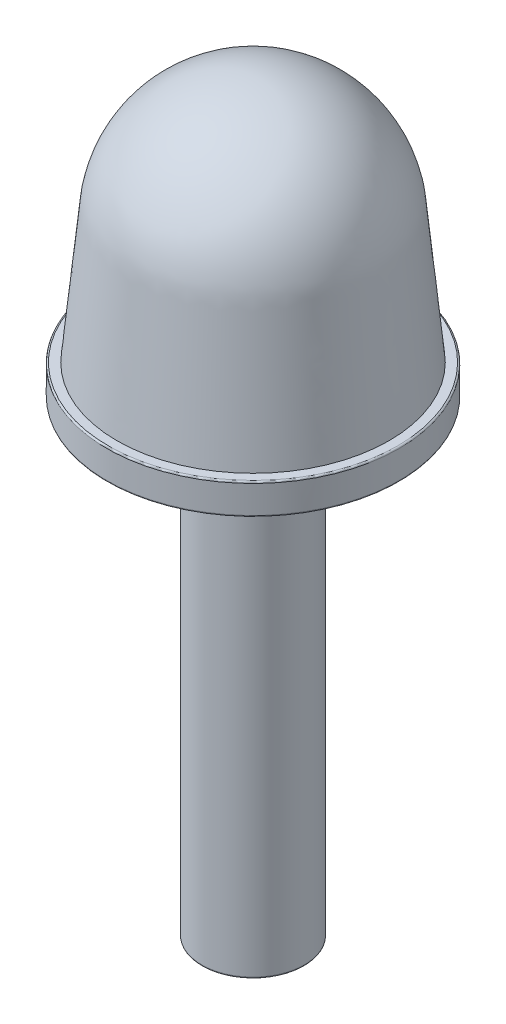
ISO-10303-21;
HEADER;
FILE_DESCRIPTION(('STEP AP214'),'2;1');
FILE_NAME('part.step','',(''),(''),'','','');
FILE_SCHEMA(('AUTOMOTIVE_DESIGN { 1 0 10303 214 1 1 1 1 }'));
ENDSEC;
DATA;
#1=APPLICATION_CONTEXT('core data for automotive mechanical design processes');
#2=APPLICATION_PROTOCOL_DEFINITION('international standard','automotive_design',2000,#1);
#3=PRODUCT_CONTEXT('',#1,'mechanical');
#4=PRODUCT('Part','Part','',(#3));
#5=PRODUCT_RELATED_PRODUCT_CATEGORY('part','',(#4));
#6=PRODUCT_DEFINITION_FORMATION('','',#4);
#7=PRODUCT_DEFINITION_CONTEXT('part definition',#1,'design');
#8=PRODUCT_DEFINITION('design','',#6,#7);
#9=PRODUCT_DEFINITION_SHAPE('','',#8);
#10=(LENGTH_UNIT() NAMED_UNIT(*) SI_UNIT(.MILLI.,.METRE.));
#11=(NAMED_UNIT(*) PLANE_ANGLE_UNIT() SI_UNIT($,.RADIAN.));
#12=(NAMED_UNIT(*) SI_UNIT($,.STERADIAN.) SOLID_ANGLE_UNIT());
#13=UNCERTAINTY_MEASURE_WITH_UNIT(LENGTH_MEASURE(1.E-05),#10,'distance_accuracy_value','');
#14=(GEOMETRIC_REPRESENTATION_CONTEXT(3) GLOBAL_UNCERTAINTY_ASSIGNED_CONTEXT((#13)) GLOBAL_UNIT_ASSIGNED_CONTEXT((#10,
#11,#12)) REPRESENTATION_CONTEXT('',''));
#15=CARTESIAN_POINT('',(0.,0.,0.));
#16=DIRECTION('',(0.,0.,1.));
#17=DIRECTION('',(1.,0.,0.));
#18=AXIS2_PLACEMENT_3D('',#15,#16,#17);
#19=CARTESIAN_POINT('',(13.25,-24.,0.));
#20=CARTESIAN_POINT('',(12.8762888931904,-20.234768096144,0.));
#21=CARTESIAN_POINT('',(12.5025777863808,-16.4695361922879,0.));
#22=CARTESIAN_POINT('',(12.1288666795712,-12.7043042884319,0.));
#23=CARTESIAN_POINT('',(12.1080288298059,-12.4943577941634,0.));
#24=CARTESIAN_POINT('',(12.0663531302754,-12.0744648056265,0.));
#25=CARTESIAN_POINT('',(12.0038395809797,-11.4446253228211,0.));
#26=CARTESIAN_POINT('',(11.9621638814492,-11.0247323342841,0.));
#27=CARTESIAN_POINT('',(11.9413260316839,-10.8147858400157,0.));
#28=CARTESIAN_POINT('',(11.9136003956724,-10.535443194418,0.));
#29=CARTESIAN_POINT('',(11.8581491236493,-9.97675790322282,0.));
#30=CARTESIAN_POINT('',(11.6665551392833,-9.1489857320982,0.));
#31=CARTESIAN_POINT('',(11.5141248420591,-8.60828507300223,0.));
#32=CARTESIAN_POINT('',(11.4285286542079,-8.34093826234789,0.));
#33=CARTESIAN_POINT('',(9.77905012195438,-3.18904031091958,0.));
#34=CARTESIAN_POINT('',(5.40951309549189,0.,0.));
#35=CARTESIAN_POINT('',(1.74198293753745E-13,0.,0.));
#36=(BOUNDED_CURVE() B_SPLINE_CURVE(3,(#19,#20,#21,#22,#23,#24,#25,#26,#27,#28,#29,#30,#31,#32,
#33,#34,#35),.UNSPECIFIED.,.F.,.F.) B_SPLINE_CURVE_WITH_KNOTS((4,3,1,1,3,1,1,3,4),(0.,
0.379321245469799,0.400471912340112,0.421622579210425,0.442773246080738,0.47091509841456,
0.499056950748383,0.527198803082205,1.),
.UNSPECIFIED.) CURVE() GEOMETRIC_REPRESENTATION_ITEM() RATIONAL_B_SPLINE_CURVE((1.,1.,1.,1.,1.,
1.,1.,1.,1.,1.,1.,1.,1.,1.,0.871833681310322,0.871833681310322,1.)) REPRESENTATION_ITEM(''));
#37=CARTESIAN_POINT('',(1.74198293753745E-13,0.,0.));
#38=DIRECTION('',(0.,1.,0.));
#39=AXIS1_PLACEMENT('',#37,#38);
#40=SURFACE_OF_REVOLUTION('',#36,#39);
#41=CARTESIAN_POINT('',(1.74198293753745E-13,0.,0.));
#42=VERTEX_POINT('',#41);
#43=VERTEX_LOOP('',#42);
#44=FACE_BOUND('',#43,.T.);
#45=CARTESIAN_POINT('',(1.19471804001493E-13,-24.,0.));
#46=DIRECTION('',(0.,1.,0.));
#47=DIRECTION('',(-1.,0.,0.));
#48=AXIS2_PLACEMENT_3D('',#45,#46,#47);
#49=CIRCLE('',#48,13.2499999999999);
#50=CARTESIAN_POINT('',(-13.2499999999998,-23.9999999999999,0.));
#51=VERTEX_POINT('',#50);
#52=EDGE_CURVE('E49',#51,#51,#49,.T.);
#53=ORIENTED_EDGE('',*,*,#52,.T.);
#54=EDGE_LOOP('',(#53));
#55=FACE_BOUND('',#54,.T.);
#56=ADVANCED_FACE('F33',(#44,#55),#40,.T.);
#57=CARTESIAN_POINT('',(13.25,-24.,0.));
#58=DIRECTION('',(0.,-1.,0.));
#59=DIRECTION('',(1.,0.,0.));
#60=AXIS2_PLACEMENT_3D('',#57,#58,#59);
#61=PLANE('',#60);
#62=CARTESIAN_POINT('',(1.19471804001493E-13,-24.,0.));
#63=DIRECTION('',(0.,-1.,0.));
#64=DIRECTION('',(1.,0.,0.));
#65=AXIS2_PLACEMENT_3D('',#62,#63,#64);
#66=CIRCLE('',#65,14.0999999999999);
#67=CARTESIAN_POINT('',(14.1,-24.,0.));
#68=VERTEX_POINT('',#67);
#69=EDGE_CURVE('E11',#68,#68,#66,.F.);
#70=ORIENTED_EDGE('',*,*,#69,.T.);
#71=EDGE_LOOP('',(#70));
#72=FACE_BOUND('',#71,.T.);
#73=ORIENTED_EDGE('',*,*,#52,.F.);
#74=EDGE_LOOP('',(#73));
#75=FACE_BOUND('',#74,.T.);
#76=ADVANCED_FACE('F45',(#72,#75),#61,.F.);
#77=CARTESIAN_POINT('',(1.74198293753745E-13,0.,0.));
#78=DIRECTION('',(0.,1.,0.));
#79=DIRECTION('',(-1.,0.,0.));
#80=AXIS2_PLACEMENT_3D('',#77,#78,#79);
#81=CYLINDRICAL_SURFACE('',#80,14.2499999999999);
#82=CARTESIAN_POINT('',(1.12973033343413E-13,-26.85,0.));
#83=DIRECTION('',(0.,1.,0.));
#84=DIRECTION('',(-1.,0.,0.));
#85=AXIS2_PLACEMENT_3D('',#82,#83,#84);
#86=CIRCLE('',#85,14.2499999999999);
#87=CARTESIAN_POINT('',(-14.2499999999998,-26.8499999999999,0.));
#88=VERTEX_POINT('',#87);
#89=EDGE_CURVE('E40',#88,#88,#86,.T.);
#90=ORIENTED_EDGE('',*,*,#89,.T.);
#91=EDGE_LOOP('',(#90));
#92=FACE_BOUND('',#91,.T.);
#93=CARTESIAN_POINT('',(1.19129763440542E-13,-24.15,0.));
#94=DIRECTION('',(0.,-1.,0.));
#95=DIRECTION('',(1.,0.,0.));
#96=AXIS2_PLACEMENT_3D('',#93,#94,#95);
#97=CIRCLE('',#96,14.2499999999999);
#98=CARTESIAN_POINT('',(14.25,-24.15,0.));
#99=VERTEX_POINT('',#98);
#100=EDGE_CURVE('E84',#99,#99,#97,.T.);
#101=ORIENTED_EDGE('',*,*,#100,.T.);
#102=EDGE_LOOP('',(#101));
#103=FACE_BOUND('',#102,.T.);
#104=ADVANCED_FACE('F89',(#92,#103),#81,.T.);
#105=CARTESIAN_POINT('',(14.25,-27.,0.));
#106=DIRECTION('',(0.,1.,0.));
#107=DIRECTION('',(-1.,0.,0.));
#108=AXIS2_PLACEMENT_3D('',#105,#106,#107);
#109=PLANE('',#108);
#110=CARTESIAN_POINT('',(1.12630992782462E-13,-27.,0.));
#111=DIRECTION('',(0.,1.,0.));
#112=DIRECTION('',(-1.,0.,0.));
#113=AXIS2_PLACEMENT_3D('',#110,#111,#112);
#114=CIRCLE('',#113,9.14999999999989);
#115=CARTESIAN_POINT('',(-9.14999999999978,-27.,0.));
#116=VERTEX_POINT('',#115);
#117=EDGE_CURVE('E81',#116,#116,#114,.T.);
#118=ORIENTED_EDGE('',*,*,#117,.T.);
#119=EDGE_LOOP('',(#118));
#120=FACE_BOUND('',#119,.T.);
#121=CARTESIAN_POINT('',(1.12630992782462E-13,-27.,0.));
#122=DIRECTION('',(0.,1.,0.));
#123=DIRECTION('',(-1.,0.,0.));
#124=AXIS2_PLACEMENT_3D('',#121,#122,#123);
#125=CIRCLE('',#124,14.0999999999999);
#126=CARTESIAN_POINT('',(-14.0999999999998,-26.9999999999999,0.));
#127=VERTEX_POINT('',#126);
#128=EDGE_CURVE('E78',#127,#127,#125,.F.);
#129=ORIENTED_EDGE('',*,*,#128,.T.);
#130=EDGE_LOOP('',(#129));
#131=FACE_BOUND('',#130,.T.);
#132=ADVANCED_FACE('F123',(#120,#131),#109,.F.);
#133=CARTESIAN_POINT('',(1.74198293753745E-13,0.,0.));
#134=DIRECTION('',(0.,1.,0.));
#135=DIRECTION('',(-1.,0.,0.));
#136=AXIS2_PLACEMENT_3D('',#133,#134,#135);
#137=CYLINDRICAL_SURFACE('',#136,8.99999999999989);
#138=CARTESIAN_POINT('',(1.06132222124382E-13,-29.85,0.));
#139=DIRECTION('',(0.,1.,0.));
#140=DIRECTION('',(-1.,0.,0.));
#141=AXIS2_PLACEMENT_3D('',#138,#139,#140);
#142=CIRCLE('',#141,8.99999999999989);
#143=CARTESIAN_POINT('',(-8.99999999999979,-29.85,0.));
#144=VERTEX_POINT('',#143);
#145=EDGE_CURVE('E75',#144,#144,#142,.T.);
#146=ORIENTED_EDGE('',*,*,#145,.T.);
#147=EDGE_LOOP('',(#146));
#148=FACE_BOUND('',#147,.T.);
#149=CARTESIAN_POINT('',(1.1228895222151E-13,-27.15,0.));
#150=DIRECTION('',(0.,1.,0.));
#151=DIRECTION('',(-1.,0.,0.));
#152=AXIS2_PLACEMENT_3D('',#149,#150,#151);
#153=CIRCLE('',#152,8.99999999999989);
#154=CARTESIAN_POINT('',(-8.99999999999978,-27.15,0.));
#155=VERTEX_POINT('',#154);
#156=EDGE_CURVE('E72',#155,#155,#153,.F.);
#157=ORIENTED_EDGE('',*,*,#156,.T.);
#158=EDGE_LOOP('',(#157));
#159=FACE_BOUND('',#158,.T.);
#160=ADVANCED_FACE('F126',(#148,#159),#137,.T.);
#161=CARTESIAN_POINT('',(9.,-30.,0.));
#162=DIRECTION('',(0.,1.,0.));
#163=DIRECTION('',(-1.,0.,0.));
#164=AXIS2_PLACEMENT_3D('',#161,#162,#163);
#165=PLANE('',#164);
#166=CARTESIAN_POINT('',(1.0579018156343E-13,-30.,0.));
#167=DIRECTION('',(0.,1.,0.));
#168=DIRECTION('',(-1.,0.,0.));
#169=AXIS2_PLACEMENT_3D('',#166,#167,#168);
#170=CIRCLE('',#169,5.14999999999995);
#171=CARTESIAN_POINT('',(-5.14999999999984,-30.,0.));
#172=VERTEX_POINT('',#171);
#173=EDGE_CURVE('E69',#172,#172,#170,.T.);
#174=ORIENTED_EDGE('',*,*,#173,.T.);
#175=EDGE_LOOP('',(#174));
#176=FACE_BOUND('',#175,.T.);
#177=CARTESIAN_POINT('',(1.0579018156343E-13,-30.,0.));
#178=DIRECTION('',(0.,1.,0.));
#179=DIRECTION('',(-1.,0.,0.));
#180=AXIS2_PLACEMENT_3D('',#177,#178,#179);
#181=CIRCLE('',#180,8.84999999999989);
#182=CARTESIAN_POINT('',(-8.84999999999979,-30.,0.));
#183=VERTEX_POINT('',#182);
#184=EDGE_CURVE('E66',#183,#183,#181,.F.);
#185=ORIENTED_EDGE('',*,*,#184,.T.);
#186=EDGE_LOOP('',(#185));
#187=FACE_BOUND('',#186,.T.);
#188=ADVANCED_FACE('F130',(#176,#187),#165,.F.);
#189=CARTESIAN_POINT('',(1.74198293753745E-13,0.,0.));
#190=DIRECTION('',(0.,1.,0.));
#191=DIRECTION('',(-1.,0.,0.));
#192=AXIS2_PLACEMENT_3D('',#189,#190,#191);
#193=CYLINDRICAL_SURFACE('',#192,4.99999999999995);
#194=CARTESIAN_POINT('',(0.,-72.35,0.));
#195=DIRECTION('',(0.,1.,0.));
#196=DIRECTION('',(-1.,0.,0.));
#197=AXIS2_PLACEMENT_3D('',#194,#195,#196);
#198=CIRCLE('',#197,4.99999999999995);
#199=CARTESIAN_POINT('',(-4.99999999999994,-72.35,0.));
#200=VERTEX_POINT('',#199);
#201=EDGE_CURVE('E54',#200,#200,#198,.T.);
#202=ORIENTED_EDGE('',*,*,#201,.T.);
#203=EDGE_LOOP('',(#202));
#204=FACE_BOUND('',#203,.T.);
#205=CARTESIAN_POINT('',(1.05448141002479E-13,-30.15,0.));
#206=DIRECTION('',(0.,1.,0.));
#207=DIRECTION('',(-1.,0.,0.));
#208=AXIS2_PLACEMENT_3D('',#205,#206,#207);
#209=CIRCLE('',#208,4.99999999999995);
#210=CARTESIAN_POINT('',(-4.99999999999984,-30.15,0.));
#211=VERTEX_POINT('',#210);
#212=EDGE_CURVE('E51',#211,#211,#209,.F.);
#213=ORIENTED_EDGE('',*,*,#212,.T.);
#214=EDGE_LOOP('',(#213));
#215=FACE_BOUND('',#214,.T.);
#216=ADVANCED_FACE('F134',(#204,#215),#193,.T.);
#217=CARTESIAN_POINT('',(5.00000000000001,-72.5,0.));
#218=DIRECTION('',(0.,1.,0.));
#219=DIRECTION('',(-1.,0.,0.));
#220=AXIS2_PLACEMENT_3D('',#217,#218,#219);
#221=PLANE('',#220);
#222=CARTESIAN_POINT('',(0.,-72.5,0.));
#223=DIRECTION('',(0.,1.,0.));
#224=DIRECTION('',(-1.,0.,0.));
#225=AXIS2_PLACEMENT_3D('',#222,#223,#224);
#226=CIRCLE('',#225,4.84999999999995);
#227=CARTESIAN_POINT('',(-4.84999999999994,-72.5,0.));
#228=VERTEX_POINT('',#227);
#229=EDGE_CURVE('E63',#228,#228,#226,.F.);
#230=ORIENTED_EDGE('',*,*,#229,.T.);
#231=EDGE_LOOP('',(#230));
#232=FACE_BOUND('',#231,.T.);
#233=ADVANCED_FACE('F115',(#232),#221,.F.);
#234=CARTESIAN_POINT('',(0.,-72.35,0.));
#235=DIRECTION('',(0.,1.,0.));
#236=DIRECTION('',(-1.,0.,0.));
#237=AXIS2_PLACEMENT_3D('',#234,#235,#236);
#238=TOROIDAL_SURFACE('',#237,4.84999999999995,0.15);
#239=ORIENTED_EDGE('',*,*,#229,.F.);
#240=EDGE_LOOP('',(#239));
#241=FACE_BOUND('',#240,.T.);
#242=ORIENTED_EDGE('',*,*,#201,.F.);
#243=EDGE_LOOP('',(#242));
#244=FACE_BOUND('',#243,.T.);
#245=ADVANCED_FACE('F112',(#241,#244),#238,.T.);
#246=CARTESIAN_POINT('',(1.05448141002479E-13,-30.15,0.));
#247=DIRECTION('',(0.,1.,0.));
#248=DIRECTION('',(-1.,0.,0.));
#249=AXIS2_PLACEMENT_3D('',#246,#247,#248);
#250=TOROIDAL_SURFACE('',#249,5.14999999999995,0.15);
#251=ORIENTED_EDGE('',*,*,#212,.F.);
#252=EDGE_LOOP('',(#251));
#253=FACE_BOUND('',#252,.T.);
#254=ORIENTED_EDGE('',*,*,#173,.F.);
#255=EDGE_LOOP('',(#254));
#256=FACE_BOUND('',#255,.T.);
#257=ADVANCED_FACE('F108',(#253,#256),#250,.F.);
#258=CARTESIAN_POINT('',(1.06132222124382E-13,-29.85,0.));
#259=DIRECTION('',(0.,1.,0.));
#260=DIRECTION('',(-1.,0.,0.));
#261=AXIS2_PLACEMENT_3D('',#258,#259,#260);
#262=TOROIDAL_SURFACE('',#261,8.84999999999989,0.15);
#263=ORIENTED_EDGE('',*,*,#184,.F.);
#264=EDGE_LOOP('',(#263));
#265=FACE_BOUND('',#264,.T.);
#266=ORIENTED_EDGE('',*,*,#145,.F.);
#267=EDGE_LOOP('',(#266));
#268=FACE_BOUND('',#267,.T.);
#269=ADVANCED_FACE('F101',(#265,#268),#262,.T.);
#270=CARTESIAN_POINT('',(1.1228895222151E-13,-27.15,0.));
#271=DIRECTION('',(0.,1.,0.));
#272=DIRECTION('',(-1.,0.,0.));
#273=AXIS2_PLACEMENT_3D('',#270,#271,#272);
#274=TOROIDAL_SURFACE('',#273,9.14999999999989,0.15);
#275=ORIENTED_EDGE('',*,*,#156,.F.);
#276=EDGE_LOOP('',(#275));
#277=FACE_BOUND('',#276,.T.);
#278=ORIENTED_EDGE('',*,*,#117,.F.);
#279=EDGE_LOOP('',(#278));
#280=FACE_BOUND('',#279,.T.);
#281=ADVANCED_FACE('F94',(#277,#280),#274,.F.);
#282=CARTESIAN_POINT('',(1.12973033343413E-13,-26.85,0.));
#283=DIRECTION('',(0.,1.,0.));
#284=DIRECTION('',(-1.,0.,0.));
#285=AXIS2_PLACEMENT_3D('',#282,#283,#284);
#286=TOROIDAL_SURFACE('',#285,14.0999999999999,0.15);
#287=ORIENTED_EDGE('',*,*,#128,.F.);
#288=EDGE_LOOP('',(#287));
#289=FACE_BOUND('',#288,.T.);
#290=ORIENTED_EDGE('',*,*,#89,.F.);
#291=EDGE_LOOP('',(#290));
#292=FACE_BOUND('',#291,.T.);
#293=ADVANCED_FACE('F92',(#289,#292),#286,.T.);
#294=CARTESIAN_POINT('',(1.19129763440542E-13,-24.15,0.));
#295=DIRECTION('',(0.,-1.,0.));
#296=DIRECTION('',(1.,0.,0.));
#297=AXIS2_PLACEMENT_3D('',#294,#295,#296);
#298=TOROIDAL_SURFACE('',#297,14.0999999999999,0.15);
#299=ORIENTED_EDGE('',*,*,#100,.F.);
#300=EDGE_LOOP('',(#299));
#301=FACE_BOUND('',#300,.T.);
#302=ORIENTED_EDGE('',*,*,#69,.F.);
#303=EDGE_LOOP('',(#302));
#304=FACE_BOUND('',#303,.T.);
#305=ADVANCED_FACE('F35',(#301,#304),#298,.T.);
#306=CLOSED_SHELL('',(#56,#76,#104,#132,#160,#188,#216,#233,#245,#257,#269,#281,#293,#305));
#307=MANIFOLD_SOLID_BREP('B2',#306);
#308=ADVANCED_BREP_SHAPE_REPRESENTATION('',(#18,#307),#14);
#309=SHAPE_DEFINITION_REPRESENTATION(#9,#308);
ENDSEC;
END-ISO-10303-21;
